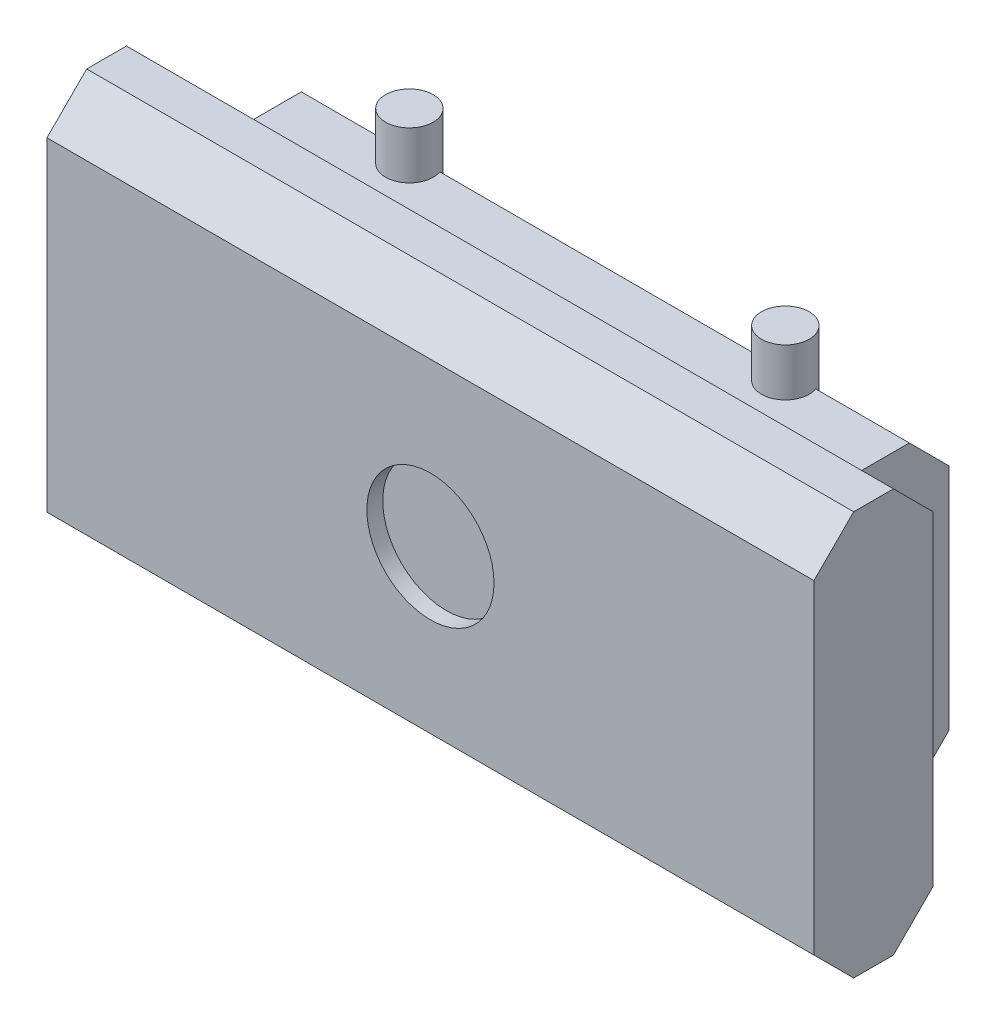
ISO-10303-21;
HEADER;
FILE_DESCRIPTION(('STEP AP214'),'2;1');
FILE_NAME('part.step','',(''),(''),'','','');
FILE_SCHEMA(('AUTOMOTIVE_DESIGN { 1 0 10303 214 1 1 1 1 }'));
ENDSEC;
DATA;
#1=APPLICATION_CONTEXT('core data for automotive mechanical design processes');
#2=APPLICATION_PROTOCOL_DEFINITION('international standard','automotive_design',2000,#1);
#3=PRODUCT_CONTEXT('',#1,'mechanical');
#4=PRODUCT('Part','Part','',(#3));
#5=PRODUCT_RELATED_PRODUCT_CATEGORY('part','',(#4));
#6=PRODUCT_DEFINITION_FORMATION('','',#4);
#7=PRODUCT_DEFINITION_CONTEXT('part definition',#1,'design');
#8=PRODUCT_DEFINITION('design','',#6,#7);
#9=PRODUCT_DEFINITION_SHAPE('','',#8);
#10=(LENGTH_UNIT() NAMED_UNIT(*) SI_UNIT(.MILLI.,.METRE.));
#11=(NAMED_UNIT(*) PLANE_ANGLE_UNIT() SI_UNIT($,.RADIAN.));
#12=(NAMED_UNIT(*) SI_UNIT($,.STERADIAN.) SOLID_ANGLE_UNIT());
#13=UNCERTAINTY_MEASURE_WITH_UNIT(LENGTH_MEASURE(1.E-05),#10,'distance_accuracy_value','');
#14=(GEOMETRIC_REPRESENTATION_CONTEXT(3) GLOBAL_UNCERTAINTY_ASSIGNED_CONTEXT((#13)) GLOBAL_UNIT_ASSIGNED_CONTEXT((#10,
#11,#12)) REPRESENTATION_CONTEXT('',''));
#15=CARTESIAN_POINT('',(0.,0.,0.));
#16=DIRECTION('',(0.,0.,1.));
#17=DIRECTION('',(1.,0.,0.));
#18=AXIS2_PLACEMENT_3D('',#15,#16,#17);
#19=CARTESIAN_POINT('',(236.5,194.,-60.));
#20=DIRECTION('',(0.,1.,0.));
#21=DIRECTION('',(0.,0.,1.));
#22=AXIS2_PLACEMENT_3D('',#19,#20,#21);
#23=CYLINDRICAL_SURFACE('',#22,30.);
#24=CARTESIAN_POINT('',(236.5,194.,-60.));
#25=DIRECTION('',(0.,-1.,0.));
#26=DIRECTION('',(0.,0.,-1.));
#27=AXIS2_PLACEMENT_3D('',#24,#25,#26);
#28=CIRCLE('',#27,30.);
#29=CARTESIAN_POINT('',(264.784271247462,194.,-70.0000000000002));
#30=VERTEX_POINT('',#29);
#31=CARTESIAN_POINT('',(208.215728752538,194.,-70.0000000000002));
#32=VERTEX_POINT('',#31);
#33=EDGE_CURVE('E270',#30,#32,#28,.T.);
#34=ORIENTED_EDGE('',*,*,#33,.F.);
#35=CARTESIAN_POINT('',(236.5,204.,-60.));
#36=DIRECTION('',(0.,0.707106781186546,-0.707106781186549));
#37=DIRECTION('',(0.,0.707106781186549,0.707106781186546));
#38=AXIS2_PLACEMENT_3D('',#35,#36,#37);
#39=ELLIPSE('',#38,42.426406871193,30.);
#40=EDGE_CURVE('E368',#30,#32,#39,.T.);
#41=ORIENTED_EDGE('',*,*,#40,.T.);
#42=EDGE_LOOP('',(#34,#41));
#43=FACE_BOUND('',#42,.T.);
#44=CARTESIAN_POINT('',(236.5,254.,-60.));
#45=DIRECTION('',(0.,-1.,0.));
#46=DIRECTION('',(0.,0.,-1.));
#47=AXIS2_PLACEMENT_3D('',#44,#45,#46);
#48=CIRCLE('',#47,30.);
#49=CARTESIAN_POINT('',(236.5,254.,-90.));
#50=VERTEX_POINT('',#49);
#51=EDGE_CURVE('E266',#50,#50,#48,.T.);
#52=ORIENTED_EDGE('',*,*,#51,.T.);
#53=EDGE_LOOP('',(#52));
#54=FACE_BOUND('',#53,.T.);
#55=ADVANCED_FACE('F47',(#43,#54),#23,.T.);
#56=CARTESIAN_POINT('',(236.5,254.,-60.));
#57=DIRECTION('',(0.,-1.,0.));
#58=DIRECTION('',(0.,0.,-1.));
#59=AXIS2_PLACEMENT_3D('',#56,#57,#58);
#60=PLANE('',#59);
#61=ORIENTED_EDGE('',*,*,#51,.F.);
#62=EDGE_LOOP('',(#61));
#63=FACE_BOUND('',#62,.T.);
#64=ADVANCED_FACE('F428',(#63),#60,.F.);
#65=CARTESIAN_POINT('',(-236.5,194.,-60.));
#66=DIRECTION('',(0.,1.,0.));
#67=DIRECTION('',(0.,0.,1.));
#68=AXIS2_PLACEMENT_3D('',#65,#66,#67);
#69=CYLINDRICAL_SURFACE('',#68,30.);
#70=CARTESIAN_POINT('',(-236.5,194.,-60.));
#71=DIRECTION('',(0.,-1.,0.));
#72=DIRECTION('',(0.,0.,-1.));
#73=AXIS2_PLACEMENT_3D('',#70,#71,#72);
#74=CIRCLE('',#73,30.);
#75=CARTESIAN_POINT('',(-208.215728752538,194.,-70.0000000000002));
#76=VERTEX_POINT('',#75);
#77=CARTESIAN_POINT('',(-264.784271247462,194.,-70.0000000000002));
#78=VERTEX_POINT('',#77);
#79=EDGE_CURVE('E262',#76,#78,#74,.T.);
#80=ORIENTED_EDGE('',*,*,#79,.F.);
#81=CARTESIAN_POINT('',(-236.5,204.,-60.));
#82=DIRECTION('',(0.,0.707106781186546,-0.707106781186549));
#83=DIRECTION('',(0.,0.707106781186549,0.707106781186546));
#84=AXIS2_PLACEMENT_3D('',#81,#82,#83);
#85=ELLIPSE('',#84,42.426406871193,30.);
#86=EDGE_CURVE('E371',#76,#78,#85,.T.);
#87=ORIENTED_EDGE('',*,*,#86,.T.);
#88=EDGE_LOOP('',(#80,#87));
#89=FACE_BOUND('',#88,.T.);
#90=CARTESIAN_POINT('',(-236.5,254.,-60.));
#91=DIRECTION('',(0.,-1.,0.));
#92=DIRECTION('',(0.,0.,-1.));
#93=AXIS2_PLACEMENT_3D('',#90,#91,#92);
#94=CIRCLE('',#93,30.);
#95=CARTESIAN_POINT('',(-236.5,254.,-90.));
#96=VERTEX_POINT('',#95);
#97=EDGE_CURVE('E261',#96,#96,#94,.T.);
#98=ORIENTED_EDGE('',*,*,#97,.T.);
#99=EDGE_LOOP('',(#98));
#100=FACE_BOUND('',#99,.T.);
#101=ADVANCED_FACE('F434',(#89,#100),#69,.T.);
#102=CARTESIAN_POINT('',(-236.5,254.,-60.));
#103=DIRECTION('',(0.,-1.,0.));
#104=DIRECTION('',(0.,0.,-1.));
#105=AXIS2_PLACEMENT_3D('',#102,#103,#104);
#106=PLANE('',#105);
#107=ORIENTED_EDGE('',*,*,#97,.F.);
#108=EDGE_LOOP('',(#107));
#109=FACE_BOUND('',#108,.T.);
#110=ADVANCED_FACE('F382',(#109),#106,.F.);
#111=CARTESIAN_POINT('',(-482.5,-254.,150.));
#112=DIRECTION('',(1.,0.,0.));
#113=DIRECTION('',(0.,0.,-1.));
#114=AXIS2_PLACEMENT_3D('',#111,#112,#113);
#115=PLANE('',#114);
#116=CARTESIAN_POINT('',(-482.5,-114.,75.));
#117=DIRECTION('',(1.,0.,0.));
#118=DIRECTION('',(0.,0.,-1.));
#119=AXIS2_PLACEMENT_3D('',#116,#117,#118);
#120=CIRCLE('',#119,60.);
#121=CARTESIAN_POINT('',(-482.5,-114.,15.));
#122=VERTEX_POINT('',#121);
#123=EDGE_CURVE('E11',#122,#122,#120,.F.);
#124=ORIENTED_EDGE('',*,*,#123,.F.);
#125=EDGE_LOOP('',(#124));
#126=FACE_BOUND('',#125,.T.);
#127=CARTESIAN_POINT('',(-482.5,114.,75.));
#128=DIRECTION('',(1.,0.,0.));
#129=DIRECTION('',(0.,0.,-1.));
#130=AXIS2_PLACEMENT_3D('',#127,#128,#129);
#131=CIRCLE('',#130,60.);
#132=CARTESIAN_POINT('',(-482.5,114.,15.));
#133=VERTEX_POINT('',#132);
#134=EDGE_CURVE('E57',#133,#133,#131,.F.);
#135=ORIENTED_EDGE('',*,*,#134,.F.);
#136=EDGE_LOOP('',(#135));
#137=FACE_BOUND('',#136,.T.);
#138=DIRECTION('',(0.,-1.,0.));
#139=VECTOR('',#138,1.);
#140=CARTESIAN_POINT('',(-482.5,-254.,0.));
#141=LINE('',#140,#139);
#142=CARTESIAN_POINT('',(-482.5,204.,0.));
#143=VERTEX_POINT('',#142);
#144=CARTESIAN_POINT('',(-482.5,-204.,0.));
#145=VERTEX_POINT('',#144);
#146=EDGE_CURVE('E225',#143,#145,#141,.T.);
#147=ORIENTED_EDGE('',*,*,#146,.T.);
#148=DIRECTION('',(0.,0.707106781186548,-0.707106781186547));
#149=VECTOR('',#148,1.);
#150=CARTESIAN_POINT('',(-482.5,-254.,50.));
#151=LINE('',#150,#149);
#152=CARTESIAN_POINT('',(-482.5,-254.,50.));
#153=VERTEX_POINT('',#152);
#154=EDGE_CURVE('E345',#145,#153,#151,.F.);
#155=ORIENTED_EDGE('',*,*,#154,.T.);
#156=DIRECTION('',(0.,0.,-1.));
#157=VECTOR('',#156,1.);
#158=CARTESIAN_POINT('',(-482.5,-254.,150.));
#159=LINE('',#158,#157);
#160=CARTESIAN_POINT('',(-482.5,-254.,99.9999999999998));
#161=VERTEX_POINT('',#160);
#162=EDGE_CURVE('E257',#161,#153,#159,.T.);
#163=ORIENTED_EDGE('',*,*,#162,.F.);
#164=DIRECTION('',(0.,0.707106781186547,0.707106781186548));
#165=VECTOR('',#164,1.);
#166=CARTESIAN_POINT('',(-482.5,-204.,150.));
#167=LINE('',#166,#165);
#168=CARTESIAN_POINT('',(-482.5,-204.,150.));
#169=VERTEX_POINT('',#168);
#170=EDGE_CURVE('E340',#161,#169,#167,.T.);
#171=ORIENTED_EDGE('',*,*,#170,.T.);
#172=DIRECTION('',(0.,-1.,0.));
#173=VECTOR('',#172,1.);
#174=CARTESIAN_POINT('',(-482.5,-254.,150.));
#175=LINE('',#174,#173);
#176=CARTESIAN_POINT('',(-482.5,204.,150.));
#177=VERTEX_POINT('',#176);
#178=EDGE_CURVE('E231',#177,#169,#175,.T.);
#179=ORIENTED_EDGE('',*,*,#178,.F.);
#180=DIRECTION('',(0.,0.707106781186547,-0.707106781186548));
#181=VECTOR('',#180,1.);
#182=CARTESIAN_POINT('',(-482.5,204.,150.));
#183=LINE('',#182,#181);
#184=CARTESIAN_POINT('',(-482.5,254.,99.9999999999998));
#185=VERTEX_POINT('',#184);
#186=EDGE_CURVE('E72',#177,#185,#183,.T.);
#187=ORIENTED_EDGE('',*,*,#186,.T.);
#188=DIRECTION('',(0.,0.,-1.));
#189=VECTOR('',#188,1.);
#190=CARTESIAN_POINT('',(-482.5,254.,150.));
#191=LINE('',#190,#189);
#192=CARTESIAN_POINT('',(-482.5,254.,50.));
#193=VERTEX_POINT('',#192);
#194=EDGE_CURVE('E240',#185,#193,#191,.T.);
#195=ORIENTED_EDGE('',*,*,#194,.T.);
#196=DIRECTION('',(0.,0.707106781186548,0.707106781186547));
#197=VECTOR('',#196,1.);
#198=CARTESIAN_POINT('',(-482.5,254.,50.0000000000001));
#199=LINE('',#198,#197);
#200=EDGE_CURVE('E64',#193,#143,#199,.F.);
#201=ORIENTED_EDGE('',*,*,#200,.T.);
#202=EDGE_LOOP('',(#147,#155,#163,#171,#179,#187,#195,#201));
#203=FACE_BOUND('',#202,.T.);
#204=ADVANCED_FACE('F379',(#126,#137,#203),#115,.F.);
#205=CARTESIAN_POINT('',(482.5,-254.,150.));
#206=DIRECTION('',(0.,1.,0.));
#207=DIRECTION('',(-1.,0.,0.));
#208=AXIS2_PLACEMENT_3D('',#205,#206,#207);
#209=PLANE('',#208);
#210=ORIENTED_EDGE('',*,*,#162,.T.);
#211=DIRECTION('',(1.,0.,0.));
#212=VECTOR('',#211,1.);
#213=CARTESIAN_POINT('',(482.5,-254.,50.));
#214=LINE('',#213,#212);
#215=CARTESIAN_POINT('',(482.5,-254.,50.));
#216=VERTEX_POINT('',#215);
#217=EDGE_CURVE('E316',#153,#216,#214,.T.);
#218=ORIENTED_EDGE('',*,*,#217,.T.);
#219=DIRECTION('',(0.,0.,-1.));
#220=VECTOR('',#219,1.);
#221=CARTESIAN_POINT('',(482.5,-254.,150.));
#222=LINE('',#221,#220);
#223=CARTESIAN_POINT('',(482.5,-254.,99.9999999999998));
#224=VERTEX_POINT('',#223);
#225=EDGE_CURVE('E253',#224,#216,#222,.T.);
#226=ORIENTED_EDGE('',*,*,#225,.F.);
#227=DIRECTION('',(-1.,0.,0.));
#228=VECTOR('',#227,1.);
#229=CARTESIAN_POINT('',(-482.5,-254.,99.9999999999998));
#230=LINE('',#229,#228);
#231=EDGE_CURVE('E313',#224,#161,#230,.T.);
#232=ORIENTED_EDGE('',*,*,#231,.T.);
#233=EDGE_LOOP('',(#210,#218,#226,#232));
#234=FACE_BOUND('',#233,.T.);
#235=ADVANCED_FACE('F381',(#234),#209,.F.);
#236=CARTESIAN_POINT('',(482.5,-254.,150.));
#237=DIRECTION('',(-1.,0.,0.));
#238=DIRECTION('',(0.,0.,1.));
#239=AXIS2_PLACEMENT_3D('',#236,#237,#238);
#240=PLANE('',#239);
#241=ORIENTED_EDGE('',*,*,#225,.T.);
#242=DIRECTION('',(0.,-0.707106781186548,0.707106781186547));
#243=VECTOR('',#242,1.);
#244=CARTESIAN_POINT('',(482.5,-254.,50.));
#245=LINE('',#244,#243);
#246=CARTESIAN_POINT('',(482.5,-204.,0.));
#247=VERTEX_POINT('',#246);
#248=EDGE_CURVE('E329',#216,#247,#245,.F.);
#249=ORIENTED_EDGE('',*,*,#248,.T.);
#250=DIRECTION('',(0.,1.,0.));
#251=VECTOR('',#250,1.);
#252=CARTESIAN_POINT('',(482.5,-254.,0.));
#253=LINE('',#252,#251);
#254=CARTESIAN_POINT('',(482.5,204.,0.));
#255=VERTEX_POINT('',#254);
#256=EDGE_CURVE('E236',#247,#255,#253,.T.);
#257=ORIENTED_EDGE('',*,*,#256,.T.);
#258=DIRECTION('',(0.,-0.707106781186548,-0.707106781186547));
#259=VECTOR('',#258,1.);
#260=CARTESIAN_POINT('',(482.5,254.,50.));
#261=LINE('',#260,#259);
#262=CARTESIAN_POINT('',(482.5,254.,50.));
#263=VERTEX_POINT('',#262);
#264=EDGE_CURVE('E326',#255,#263,#261,.F.);
#265=ORIENTED_EDGE('',*,*,#264,.T.);
#266=DIRECTION('',(0.,0.,-1.));
#267=VECTOR('',#266,1.);
#268=CARTESIAN_POINT('',(482.5,254.,150.));
#269=LINE('',#268,#267);
#270=CARTESIAN_POINT('',(482.5,254.,99.9999999999998));
#271=VERTEX_POINT('',#270);
#272=EDGE_CURVE('E249',#271,#263,#269,.T.);
#273=ORIENTED_EDGE('',*,*,#272,.F.);
#274=DIRECTION('',(0.,-0.707106781186547,0.707106781186548));
#275=VECTOR('',#274,1.);
#276=CARTESIAN_POINT('',(482.5,204.,150.));
#277=LINE('',#276,#275);
#278=CARTESIAN_POINT('',(482.5,204.,150.));
#279=VERTEX_POINT('',#278);
#280=EDGE_CURVE('E320',#271,#279,#277,.T.);
#281=ORIENTED_EDGE('',*,*,#280,.T.);
#282=DIRECTION('',(0.,1.,0.));
#283=VECTOR('',#282,1.);
#284=CARTESIAN_POINT('',(482.5,-254.,150.));
#285=LINE('',#284,#283);
#286=CARTESIAN_POINT('',(482.5,-204.,150.));
#287=VERTEX_POINT('',#286);
#288=EDGE_CURVE('E235',#287,#279,#285,.T.);
#289=ORIENTED_EDGE('',*,*,#288,.F.);
#290=DIRECTION('',(0.,-0.707106781186547,-0.707106781186548));
#291=VECTOR('',#290,1.);
#292=CARTESIAN_POINT('',(482.5,-204.,150.));
#293=LINE('',#292,#291);
#294=EDGE_CURVE('E323',#287,#224,#293,.T.);
#295=ORIENTED_EDGE('',*,*,#294,.T.);
#296=EDGE_LOOP('',(#241,#249,#257,#265,#273,#281,#289,#295));
#297=FACE_BOUND('',#296,.T.);
#298=ADVANCED_FACE('F398',(#297),#240,.F.);
#299=CARTESIAN_POINT('',(482.5,254.,150.));
#300=DIRECTION('',(0.,-1.,0.));
#301=DIRECTION('',(1.,0.,0.));
#302=AXIS2_PLACEMENT_3D('',#299,#300,#301);
#303=PLANE('',#302);
#304=ORIENTED_EDGE('',*,*,#272,.T.);
#305=DIRECTION('',(-1.,0.,0.));
#306=VECTOR('',#305,1.);
#307=CARTESIAN_POINT('',(482.5,254.,50.));
#308=LINE('',#307,#306);
#309=EDGE_CURVE('E351',#263,#193,#308,.T.);
#310=ORIENTED_EDGE('',*,*,#309,.T.);
#311=ORIENTED_EDGE('',*,*,#194,.F.);
#312=DIRECTION('',(1.,0.,0.));
#313=VECTOR('',#312,1.);
#314=CARTESIAN_POINT('',(482.5,254.,99.9999999999998));
#315=LINE('',#314,#313);
#316=EDGE_CURVE('E348',#185,#271,#315,.T.);
#317=ORIENTED_EDGE('',*,*,#316,.T.);
#318=EDGE_LOOP('',(#304,#310,#311,#317));
#319=FACE_BOUND('',#318,.T.);
#320=ADVANCED_FACE('F413',(#319),#303,.F.);
#321=CARTESIAN_POINT('',(0.,0.,150.));
#322=DIRECTION('',(0.,0.,1.));
#323=DIRECTION('',(1.,0.,0.));
#324=AXIS2_PLACEMENT_3D('',#321,#322,#323);
#325=PLANE('',#324);
#326=CARTESIAN_POINT('',(0.,0.,150.));
#327=DIRECTION('',(0.,0.,1.));
#328=DIRECTION('',(1.,0.,0.));
#329=AXIS2_PLACEMENT_3D('',#326,#327,#328);
#330=CIRCLE('',#329,80.);
#331=CARTESIAN_POINT('',(80.,0.,150.));
#332=VERTEX_POINT('',#331);
#333=EDGE_CURVE('E677',#332,#332,#330,.T.);
#334=ORIENTED_EDGE('',*,*,#333,.F.);
#335=EDGE_LOOP('',(#334));
#336=FACE_BOUND('',#335,.T.);
#337=ORIENTED_EDGE('',*,*,#178,.T.);
#338=DIRECTION('',(1.,0.,0.));
#339=VECTOR('',#338,1.);
#340=CARTESIAN_POINT('',(482.5,-204.,150.));
#341=LINE('',#340,#339);
#342=EDGE_CURVE('E358',#169,#287,#341,.T.);
#343=ORIENTED_EDGE('',*,*,#342,.T.);
#344=ORIENTED_EDGE('',*,*,#288,.T.);
#345=DIRECTION('',(-1.,0.,0.));
#346=VECTOR('',#345,1.);
#347=CARTESIAN_POINT('',(-482.5,204.,150.));
#348=LINE('',#347,#346);
#349=EDGE_CURVE('E354',#279,#177,#348,.T.);
#350=ORIENTED_EDGE('',*,*,#349,.T.);
#351=EDGE_LOOP('',(#337,#343,#344,#350));
#352=FACE_BOUND('',#351,.T.);
#353=ADVANCED_FACE('F406',(#336,#352),#325,.T.);
#354=CARTESIAN_POINT('',(0.,0.,0.));
#355=DIRECTION('',(0.,0.,1.));
#356=DIRECTION('',(1.,0.,0.));
#357=AXIS2_PLACEMENT_3D('',#354,#355,#356);
#358=PLANE('',#357);
#359=DIRECTION('',(-1.,0.,0.));
#360=VECTOR('',#359,1.);
#361=CARTESIAN_POINT('',(382.5,194.,0.));
#362=LINE('',#361,#360);
#363=CARTESIAN_POINT('',(382.5,194.,0.));
#364=VERTEX_POINT('',#363);
#365=CARTESIAN_POINT('',(-382.5,194.,0.));
#366=VERTEX_POINT('',#365);
#367=EDGE_CURVE('E206',#364,#366,#362,.T.);
#368=ORIENTED_EDGE('',*,*,#367,.T.);
#369=DIRECTION('',(0.,-1.,0.));
#370=VECTOR('',#369,1.);
#371=CARTESIAN_POINT('',(-382.5,-194.,0.));
#372=LINE('',#371,#370);
#373=CARTESIAN_POINT('',(-382.5,-194.,0.));
#374=VERTEX_POINT('',#373);
#375=EDGE_CURVE('E182',#366,#374,#372,.T.);
#376=ORIENTED_EDGE('',*,*,#375,.T.);
#377=DIRECTION('',(1.,0.,0.));
#378=VECTOR('',#377,1.);
#379=CARTESIAN_POINT('',(382.5,-194.,0.));
#380=LINE('',#379,#378);
#381=CARTESIAN_POINT('',(382.5,-194.,0.));
#382=VERTEX_POINT('',#381);
#383=EDGE_CURVE('E194',#374,#382,#380,.T.);
#384=ORIENTED_EDGE('',*,*,#383,.T.);
#385=DIRECTION('',(0.,1.,0.));
#386=VECTOR('',#385,1.);
#387=CARTESIAN_POINT('',(382.5,-194.,0.));
#388=LINE('',#387,#386);
#389=EDGE_CURVE('E201',#382,#364,#388,.T.);
#390=ORIENTED_EDGE('',*,*,#389,.T.);
#391=EDGE_LOOP('',(#368,#376,#384,#390));
#392=FACE_BOUND('',#391,.T.);
#393=ORIENTED_EDGE('',*,*,#256,.F.);
#394=DIRECTION('',(-1.,0.,0.));
#395=VECTOR('',#394,1.);
#396=CARTESIAN_POINT('',(0.,-204.,0.));
#397=LINE('',#396,#395);
#398=EDGE_CURVE('E335',#247,#145,#397,.T.);
#399=ORIENTED_EDGE('',*,*,#398,.T.);
#400=ORIENTED_EDGE('',*,*,#146,.F.);
#401=DIRECTION('',(1.,0.,0.));
#402=VECTOR('',#401,1.);
#403=CARTESIAN_POINT('',(0.,204.,0.));
#404=LINE('',#403,#402);
#405=EDGE_CURVE('E332',#143,#255,#404,.T.);
#406=ORIENTED_EDGE('',*,*,#405,.T.);
#407=EDGE_LOOP('',(#393,#399,#400,#406));
#408=FACE_BOUND('',#407,.T.);
#409=ADVANCED_FACE('F203',(#392,#408),#358,.F.);
#410=CARTESIAN_POINT('',(-382.5,-194.,-120.));
#411=DIRECTION('',(-1.,0.,0.));
#412=DIRECTION('',(0.,0.,1.));
#413=AXIS2_PLACEMENT_3D('',#410,#411,#412);
#414=PLANE('',#413);
#415=DIRECTION('',(0.,-1.,0.));
#416=VECTOR('',#415,1.);
#417=CARTESIAN_POINT('',(-382.5,-194.,-120.));
#418=LINE('',#417,#416);
#419=CARTESIAN_POINT('',(-382.5,144.,-120.));
#420=VERTEX_POINT('',#419);
#421=CARTESIAN_POINT('',(-382.5,-144.,-120.));
#422=VERTEX_POINT('',#421);
#423=EDGE_CURVE('E221',#420,#422,#418,.T.);
#424=ORIENTED_EDGE('',*,*,#423,.T.);
#425=DIRECTION('',(0.,-0.707106781186549,0.707106781186546));
#426=VECTOR('',#425,1.);
#427=CARTESIAN_POINT('',(-382.5,-169.,-94.9999999999999));
#428=LINE('',#427,#426);
#429=CARTESIAN_POINT('',(-382.5,-194.,-70.0000000000001));
#430=VERTEX_POINT('',#429);
#431=EDGE_CURVE('E185',#422,#430,#428,.T.);
#432=ORIENTED_EDGE('',*,*,#431,.T.);
#433=DIRECTION('',(0.,0.,1.));
#434=VECTOR('',#433,1.);
#435=CARTESIAN_POINT('',(-382.5,-194.,-120.));
#436=LINE('',#435,#434);
#437=EDGE_CURVE('E176',#430,#374,#436,.T.);
#438=ORIENTED_EDGE('',*,*,#437,.T.);
#439=ORIENTED_EDGE('',*,*,#375,.F.);
#440=DIRECTION('',(0.,0.,1.));
#441=VECTOR('',#440,1.);
#442=CARTESIAN_POINT('',(-382.5,194.,-120.));
#443=LINE('',#442,#441);
#444=CARTESIAN_POINT('',(-382.5,194.,-70.0000000000002));
#445=VERTEX_POINT('',#444);
#446=EDGE_CURVE('E222',#445,#366,#443,.T.);
#447=ORIENTED_EDGE('',*,*,#446,.F.);
#448=DIRECTION('',(0.,-0.707106781186549,-0.707106781186546));
#449=VECTOR('',#448,1.);
#450=CARTESIAN_POINT('',(-382.5,-25.0000000000008,-289.));
#451=LINE('',#450,#449);
#452=EDGE_CURVE('E298',#445,#420,#451,.T.);
#453=ORIENTED_EDGE('',*,*,#452,.T.);
#454=EDGE_LOOP('',(#424,#432,#438,#439,#447,#453));
#455=FACE_BOUND('',#454,.T.);
#456=ADVANCED_FACE('F179',(#455),#414,.T.);
#457=CARTESIAN_POINT('',(382.5,194.,-120.));
#458=DIRECTION('',(0.,1.,0.));
#459=DIRECTION('',(0.,0.,1.));
#460=AXIS2_PLACEMENT_3D('',#457,#458,#459);
#461=PLANE('',#460);
#462=DIRECTION('',(0.,0.,1.));
#463=VECTOR('',#462,1.);
#464=CARTESIAN_POINT('',(382.5,194.,-120.));
#465=LINE('',#464,#463);
#466=CARTESIAN_POINT('',(382.5,194.,-70.0000000000002));
#467=VERTEX_POINT('',#466);
#468=EDGE_CURVE('E226',#467,#364,#465,.T.);
#469=ORIENTED_EDGE('',*,*,#468,.F.);
#470=DIRECTION('',(-1.,0.,0.));
#471=VECTOR('',#470,1.);
#472=CARTESIAN_POINT('',(-382.5,194.,-70.0000000000002));
#473=LINE('',#472,#471);
#474=EDGE_CURVE('E309',#467,#30,#473,.T.);
#475=ORIENTED_EDGE('',*,*,#474,.T.);
#476=ORIENTED_EDGE('',*,*,#33,.T.);
#477=DIRECTION('',(-1.,0.,0.));
#478=VECTOR('',#477,1.);
#479=CARTESIAN_POINT('',(-382.5,194.,-70.0000000000002));
#480=LINE('',#479,#478);
#481=EDGE_CURVE('E306',#32,#76,#480,.T.);
#482=ORIENTED_EDGE('',*,*,#481,.T.);
#483=ORIENTED_EDGE('',*,*,#79,.T.);
#484=DIRECTION('',(-1.,0.,0.));
#485=VECTOR('',#484,1.);
#486=CARTESIAN_POINT('',(-382.5,194.,-70.0000000000002));
#487=LINE('',#486,#485);
#488=EDGE_CURVE('E303',#78,#445,#487,.T.);
#489=ORIENTED_EDGE('',*,*,#488,.T.);
#490=ORIENTED_EDGE('',*,*,#446,.T.);
#491=ORIENTED_EDGE('',*,*,#367,.F.);
#492=EDGE_LOOP('',(#469,#475,#476,#482,#483,#489,#490,#491));
#493=FACE_BOUND('',#492,.T.);
#494=ADVANCED_FACE('F422',(#493),#461,.T.);
#495=CARTESIAN_POINT('',(382.5,-194.,-120.));
#496=DIRECTION('',(1.,0.,0.));
#497=DIRECTION('',(0.,0.,-1.));
#498=AXIS2_PLACEMENT_3D('',#495,#496,#497);
#499=PLANE('',#498);
#500=DIRECTION('',(0.,0.,1.));
#501=VECTOR('',#500,1.);
#502=CARTESIAN_POINT('',(382.5,-194.,-120.));
#503=LINE('',#502,#501);
#504=CARTESIAN_POINT('',(382.5,-194.,-70.0000000000001));
#505=VERTEX_POINT('',#504);
#506=EDGE_CURVE('E190',#505,#382,#503,.T.);
#507=ORIENTED_EDGE('',*,*,#506,.F.);
#508=DIRECTION('',(0.,0.707106781186549,-0.707106781186546));
#509=VECTOR('',#508,1.);
#510=CARTESIAN_POINT('',(382.5,-169.,-94.9999999999999));
#511=LINE('',#510,#509);
#512=CARTESIAN_POINT('',(382.5,-144.,-120.));
#513=VERTEX_POINT('',#512);
#514=EDGE_CURVE('E289',#505,#513,#511,.T.);
#515=ORIENTED_EDGE('',*,*,#514,.T.);
#516=DIRECTION('',(0.,1.,0.));
#517=VECTOR('',#516,1.);
#518=CARTESIAN_POINT('',(382.5,-194.,-120.));
#519=LINE('',#518,#517);
#520=CARTESIAN_POINT('',(382.5,144.,-120.));
#521=VERTEX_POINT('',#520);
#522=EDGE_CURVE('E191',#513,#521,#519,.T.);
#523=ORIENTED_EDGE('',*,*,#522,.T.);
#524=DIRECTION('',(0.,0.707106781186549,0.707106781186546));
#525=VECTOR('',#524,1.);
#526=CARTESIAN_POINT('',(382.5,-25.0000000000008,-289.));
#527=LINE('',#526,#525);
#528=EDGE_CURVE('E286',#521,#467,#527,.T.);
#529=ORIENTED_EDGE('',*,*,#528,.T.);
#530=ORIENTED_EDGE('',*,*,#468,.T.);
#531=ORIENTED_EDGE('',*,*,#389,.F.);
#532=EDGE_LOOP('',(#507,#515,#523,#529,#530,#531));
#533=FACE_BOUND('',#532,.T.);
#534=ADVANCED_FACE('F509',(#533),#499,.T.);
#535=CARTESIAN_POINT('',(382.5,-194.,-120.));
#536=DIRECTION('',(0.,-1.,0.));
#537=DIRECTION('',(0.,0.,-1.));
#538=AXIS2_PLACEMENT_3D('',#535,#536,#537);
#539=PLANE('',#538);
#540=ORIENTED_EDGE('',*,*,#437,.F.);
#541=DIRECTION('',(1.,0.,0.));
#542=VECTOR('',#541,1.);
#543=CARTESIAN_POINT('',(382.5,-194.,-70.0000000000001));
#544=LINE('',#543,#542);
#545=CARTESIAN_POINT('',(-264.784271247462,-194.,-70.0000000000001));
#546=VERTEX_POINT('',#545);
#547=EDGE_CURVE('E283',#430,#546,#544,.T.);
#548=ORIENTED_EDGE('',*,*,#547,.T.);
#549=CARTESIAN_POINT('',(-236.5,-194.,-60.));
#550=DIRECTION('',(0.,-1.,0.));
#551=DIRECTION('',(0.,0.,-1.));
#552=AXIS2_PLACEMENT_3D('',#549,#550,#551);
#553=CIRCLE('',#552,30.);
#554=CARTESIAN_POINT('',(-208.215728752538,-194.,-70.0000000000001));
#555=VERTEX_POINT('',#554);
#556=EDGE_CURVE('E702',#555,#546,#553,.T.);
#557=ORIENTED_EDGE('',*,*,#556,.F.);
#558=DIRECTION('',(1.,0.,0.));
#559=VECTOR('',#558,1.);
#560=CARTESIAN_POINT('',(382.5,-194.,-70.0000000000001));
#561=LINE('',#560,#559);
#562=CARTESIAN_POINT('',(208.215728752538,-194.,-70.0000000000001));
#563=VERTEX_POINT('',#562);
#564=EDGE_CURVE('E280',#555,#563,#561,.T.);
#565=ORIENTED_EDGE('',*,*,#564,.T.);
#566=CARTESIAN_POINT('',(236.5,-194.,-60.));
#567=DIRECTION('',(0.,-1.,0.));
#568=DIRECTION('',(0.,0.,-1.));
#569=AXIS2_PLACEMENT_3D('',#566,#567,#568);
#570=CIRCLE('',#569,30.);
#571=CARTESIAN_POINT('',(264.784271247462,-194.,-70.0000000000001));
#572=VERTEX_POINT('',#571);
#573=EDGE_CURVE('E212',#572,#563,#570,.T.);
#574=ORIENTED_EDGE('',*,*,#573,.F.);
#575=DIRECTION('',(1.,0.,0.));
#576=VECTOR('',#575,1.);
#577=CARTESIAN_POINT('',(382.5,-194.,-70.0000000000001));
#578=LINE('',#577,#576);
#579=EDGE_CURVE('E274',#572,#505,#578,.T.);
#580=ORIENTED_EDGE('',*,*,#579,.T.);
#581=ORIENTED_EDGE('',*,*,#506,.T.);
#582=ORIENTED_EDGE('',*,*,#383,.F.);
#583=EDGE_LOOP('',(#540,#548,#557,#565,#574,#580,#581,#582));
#584=FACE_BOUND('',#583,.T.);
#585=ADVANCED_FACE('F195',(#584),#539,.T.);
#586=CARTESIAN_POINT('',(0.,0.,-120.));
#587=DIRECTION('',(0.,0.,1.));
#588=DIRECTION('',(1.,0.,0.));
#589=AXIS2_PLACEMENT_3D('',#586,#587,#588);
#590=PLANE('',#589);
#591=ORIENTED_EDGE('',*,*,#522,.F.);
#592=DIRECTION('',(-1.,0.,0.));
#593=VECTOR('',#592,1.);
#594=CARTESIAN_POINT('',(-382.5,-144.,-120.));
#595=LINE('',#594,#593);
#596=EDGE_CURVE('E295',#513,#422,#595,.T.);
#597=ORIENTED_EDGE('',*,*,#596,.T.);
#598=ORIENTED_EDGE('',*,*,#423,.F.);
#599=DIRECTION('',(1.,0.,0.));
#600=VECTOR('',#599,1.);
#601=CARTESIAN_POINT('',(382.5,144.,-120.));
#602=LINE('',#601,#600);
#603=EDGE_CURVE('E292',#420,#521,#602,.T.);
#604=ORIENTED_EDGE('',*,*,#603,.T.);
#605=EDGE_LOOP('',(#591,#597,#598,#604));
#606=FACE_BOUND('',#605,.T.);
#607=ADVANCED_FACE('F502',(#606),#590,.F.);
#608=CARTESIAN_POINT('',(236.5,-254.,-60.));
#609=DIRECTION('',(0.,1.,0.));
#610=DIRECTION('',(0.,0.,1.));
#611=AXIS2_PLACEMENT_3D('',#608,#609,#610);
#612=CYLINDRICAL_SURFACE('',#611,30.);
#613=CARTESIAN_POINT('',(236.5,-254.,-60.));
#614=DIRECTION('',(0.,-1.,0.));
#615=DIRECTION('',(0.,0.,-1.));
#616=AXIS2_PLACEMENT_3D('',#613,#614,#615);
#617=CIRCLE('',#616,30.);
#618=CARTESIAN_POINT('',(236.5,-254.,-90.));
#619=VERTEX_POINT('',#618);
#620=EDGE_CURVE('E208',#619,#619,#617,.T.);
#621=ORIENTED_EDGE('',*,*,#620,.F.);
#622=EDGE_LOOP('',(#621));
#623=FACE_BOUND('',#622,.T.);
#624=ORIENTED_EDGE('',*,*,#573,.T.);
#625=CARTESIAN_POINT('',(236.5,-204.,-60.));
#626=DIRECTION('',(0.,-0.707106781186546,-0.707106781186549));
#627=DIRECTION('',(0.,0.707106781186549,-0.707106781186546));
#628=AXIS2_PLACEMENT_3D('',#625,#626,#627);
#629=ELLIPSE('',#628,42.426406871193,30.);
#630=EDGE_CURVE('E365',#563,#572,#629,.T.);
#631=ORIENTED_EDGE('',*,*,#630,.T.);
#632=EDGE_LOOP('',(#624,#631));
#633=FACE_BOUND('',#632,.T.);
#634=ADVANCED_FACE('F498',(#623,#633),#612,.T.);
#635=CARTESIAN_POINT('',(236.5,-254.,-60.));
#636=DIRECTION('',(0.,-1.,0.));
#637=DIRECTION('',(0.,0.,-1.));
#638=AXIS2_PLACEMENT_3D('',#635,#636,#637);
#639=PLANE('',#638);
#640=ORIENTED_EDGE('',*,*,#620,.T.);
#641=EDGE_LOOP('',(#640));
#642=FACE_BOUND('',#641,.T.);
#643=ADVANCED_FACE('F494',(#642),#639,.T.);
#644=CARTESIAN_POINT('',(-236.5,-254.,-60.));
#645=DIRECTION('',(0.,1.,0.));
#646=DIRECTION('',(0.,0.,1.));
#647=AXIS2_PLACEMENT_3D('',#644,#645,#646);
#648=CYLINDRICAL_SURFACE('',#647,30.);
#649=CARTESIAN_POINT('',(-236.5,-254.,-60.));
#650=DIRECTION('',(0.,-1.,0.));
#651=DIRECTION('',(0.,0.,-1.));
#652=AXIS2_PLACEMENT_3D('',#649,#650,#651);
#653=CIRCLE('',#652,30.);
#654=CARTESIAN_POINT('',(-236.5,-254.,-90.));
#655=VERTEX_POINT('',#654);
#656=EDGE_CURVE('E706',#655,#655,#653,.T.);
#657=ORIENTED_EDGE('',*,*,#656,.F.);
#658=EDGE_LOOP('',(#657));
#659=FACE_BOUND('',#658,.T.);
#660=ORIENTED_EDGE('',*,*,#556,.T.);
#661=CARTESIAN_POINT('',(-236.5,-204.,-60.));
#662=DIRECTION('',(0.,-0.707106781186546,-0.707106781186549));
#663=DIRECTION('',(0.,0.707106781186549,-0.707106781186546));
#664=AXIS2_PLACEMENT_3D('',#661,#662,#663);
#665=ELLIPSE('',#664,42.426406871193,30.);
#666=EDGE_CURVE('E362',#546,#555,#665,.T.);
#667=ORIENTED_EDGE('',*,*,#666,.T.);
#668=EDGE_LOOP('',(#660,#667));
#669=FACE_BOUND('',#668,.T.);
#670=ADVANCED_FACE('F490',(#659,#669),#648,.T.);
#671=CARTESIAN_POINT('',(-236.5,-254.,-60.));
#672=DIRECTION('',(0.,-1.,0.));
#673=DIRECTION('',(0.,0.,-1.));
#674=AXIS2_PLACEMENT_3D('',#671,#672,#673);
#675=PLANE('',#674);
#676=ORIENTED_EDGE('',*,*,#656,.T.);
#677=EDGE_LOOP('',(#676));
#678=FACE_BOUND('',#677,.T.);
#679=ADVANCED_FACE('F449',(#678),#675,.T.);
#680=CARTESIAN_POINT('',(382.5,-194.,-70.0000000000001));
#681=DIRECTION('',(0.,-0.707106781186546,-0.707106781186549));
#682=DIRECTION('',(-1.,0.,0.));
#683=AXIS2_PLACEMENT_3D('',#680,#681,#682);
#684=PLANE('',#683);
#685=ORIENTED_EDGE('',*,*,#431,.F.);
#686=ORIENTED_EDGE('',*,*,#596,.F.);
#687=ORIENTED_EDGE('',*,*,#514,.F.);
#688=ORIENTED_EDGE('',*,*,#579,.F.);
#689=ORIENTED_EDGE('',*,*,#630,.F.);
#690=ORIENTED_EDGE('',*,*,#564,.F.);
#691=ORIENTED_EDGE('',*,*,#666,.F.);
#692=ORIENTED_EDGE('',*,*,#547,.F.);
#693=EDGE_LOOP('',(#685,#686,#687,#688,#689,#690,#691,#692));
#694=FACE_BOUND('',#693,.T.);
#695=ADVANCED_FACE('F442',(#694),#684,.T.);
#696=CARTESIAN_POINT('',(382.5,194.,-70.0000000000002));
#697=DIRECTION('',(0.,0.707106781186546,-0.707106781186549));
#698=DIRECTION('',(1.,0.,0.));
#699=AXIS2_PLACEMENT_3D('',#696,#697,#698);
#700=PLANE('',#699);
#701=ORIENTED_EDGE('',*,*,#528,.F.);
#702=ORIENTED_EDGE('',*,*,#603,.F.);
#703=ORIENTED_EDGE('',*,*,#452,.F.);
#704=ORIENTED_EDGE('',*,*,#488,.F.);
#705=ORIENTED_EDGE('',*,*,#86,.F.);
#706=ORIENTED_EDGE('',*,*,#481,.F.);
#707=ORIENTED_EDGE('',*,*,#40,.F.);
#708=ORIENTED_EDGE('',*,*,#474,.F.);
#709=EDGE_LOOP('',(#701,#702,#703,#704,#705,#706,#707,#708));
#710=FACE_BOUND('',#709,.T.);
#711=ADVANCED_FACE('F448',(#710),#700,.T.);
#712=CARTESIAN_POINT('',(482.5,-254.,50.));
#713=DIRECTION('',(0.,0.707106781186547,0.707106781186548));
#714=DIRECTION('',(1.,0.,0.));
#715=AXIS2_PLACEMENT_3D('',#712,#713,#714);
#716=PLANE('',#715);
#717=ORIENTED_EDGE('',*,*,#154,.F.);
#718=ORIENTED_EDGE('',*,*,#398,.F.);
#719=ORIENTED_EDGE('',*,*,#248,.F.);
#720=ORIENTED_EDGE('',*,*,#217,.F.);
#721=EDGE_LOOP('',(#717,#718,#719,#720));
#722=FACE_BOUND('',#721,.T.);
#723=ADVANCED_FACE('F393',(#722),#716,.F.);
#724=CARTESIAN_POINT('',(482.5,254.,50.));
#725=DIRECTION('',(0.,-0.707106781186547,0.707106781186548));
#726=DIRECTION('',(-1.,0.,0.));
#727=AXIS2_PLACEMENT_3D('',#724,#725,#726);
#728=PLANE('',#727);
#729=ORIENTED_EDGE('',*,*,#264,.F.);
#730=ORIENTED_EDGE('',*,*,#405,.F.);
#731=ORIENTED_EDGE('',*,*,#200,.F.);
#732=ORIENTED_EDGE('',*,*,#309,.F.);
#733=EDGE_LOOP('',(#729,#730,#731,#732));
#734=FACE_BOUND('',#733,.T.);
#735=ADVANCED_FACE('F415',(#734),#728,.F.);
#736=CARTESIAN_POINT('',(0.,-204.,150.));
#737=DIRECTION('',(0.,-0.707106781186548,0.707106781186547));
#738=DIRECTION('',(-1.,0.,0.));
#739=AXIS2_PLACEMENT_3D('',#736,#737,#738);
#740=PLANE('',#739);
#741=ORIENTED_EDGE('',*,*,#170,.F.);
#742=ORIENTED_EDGE('',*,*,#231,.F.);
#743=ORIENTED_EDGE('',*,*,#294,.F.);
#744=ORIENTED_EDGE('',*,*,#342,.F.);
#745=EDGE_LOOP('',(#741,#742,#743,#744));
#746=FACE_BOUND('',#745,.T.);
#747=ADVANCED_FACE('F404',(#746),#740,.T.);
#748=CARTESIAN_POINT('',(0.,204.,150.));
#749=DIRECTION('',(0.,0.707106781186548,0.707106781186547));
#750=DIRECTION('',(1.,0.,0.));
#751=AXIS2_PLACEMENT_3D('',#748,#749,#750);
#752=PLANE('',#751);
#753=ORIENTED_EDGE('',*,*,#280,.F.);
#754=ORIENTED_EDGE('',*,*,#316,.F.);
#755=ORIENTED_EDGE('',*,*,#186,.F.);
#756=ORIENTED_EDGE('',*,*,#349,.F.);
#757=EDGE_LOOP('',(#753,#754,#755,#756));
#758=FACE_BOUND('',#757,.T.);
#759=ADVANCED_FACE('F50',(#758),#752,.T.);
#760=CARTESIAN_POINT('',(-492.5,114.,75.));
#761=DIRECTION('',(1.,0.,0.));
#762=DIRECTION('',(0.,0.,-1.));
#763=AXIS2_PLACEMENT_3D('',#760,#761,#762);
#764=CYLINDRICAL_SURFACE('',#763,40.);
#765=CARTESIAN_POINT('',(-492.5,114.,75.));
#766=DIRECTION('',(-1.,0.,0.));
#767=DIRECTION('',(0.,0.,1.));
#768=AXIS2_PLACEMENT_3D('',#765,#766,#767);
#769=CIRCLE('',#768,40.);
#770=CARTESIAN_POINT('',(-492.5,114.,115.));
#771=VERTEX_POINT('',#770);
#772=EDGE_CURVE('E695',#771,#771,#769,.T.);
#773=ORIENTED_EDGE('',*,*,#772,.T.);
#774=EDGE_LOOP('',(#773));
#775=FACE_BOUND('',#774,.T.);
#776=CARTESIAN_POINT('',(-482.5,114.,75.));
#777=DIRECTION('',(-1.,0.,0.));
#778=DIRECTION('',(0.,0.,1.));
#779=AXIS2_PLACEMENT_3D('',#776,#777,#778);
#780=CIRCLE('',#779,40.);
#781=CARTESIAN_POINT('',(-482.5,114.,115.));
#782=VERTEX_POINT('',#781);
#783=EDGE_CURVE('E693',#782,#782,#780,.T.);
#784=ORIENTED_EDGE('',*,*,#783,.F.);
#785=EDGE_LOOP('',(#784));
#786=FACE_BOUND('',#785,.T.);
#787=ADVANCED_FACE('F472',(#775,#786),#764,.F.);
#788=CARTESIAN_POINT('',(-492.5,114.,75.));
#789=DIRECTION('',(1.,0.,0.));
#790=DIRECTION('',(0.,0.,-1.));
#791=AXIS2_PLACEMENT_3D('',#788,#789,#790);
#792=CYLINDRICAL_SURFACE('',#791,60.);
#793=CARTESIAN_POINT('',(-492.5,114.,75.));
#794=DIRECTION('',(-1.,0.,0.));
#795=DIRECTION('',(0.,0.,1.));
#796=AXIS2_PLACEMENT_3D('',#793,#794,#795);
#797=CIRCLE('',#796,60.);
#798=CARTESIAN_POINT('',(-492.5,114.,135.));
#799=VERTEX_POINT('',#798);
#800=EDGE_CURVE('E698',#799,#799,#797,.T.);
#801=ORIENTED_EDGE('',*,*,#800,.F.);
#802=EDGE_LOOP('',(#801));
#803=FACE_BOUND('',#802,.T.);
#804=ORIENTED_EDGE('',*,*,#134,.T.);
#805=EDGE_LOOP('',(#804));
#806=FACE_BOUND('',#805,.T.);
#807=ADVANCED_FACE('F377',(#803,#806),#792,.T.);
#808=CARTESIAN_POINT('',(-492.5,0.,0.));
#809=DIRECTION('',(-1.,0.,0.));
#810=DIRECTION('',(0.,0.,1.));
#811=AXIS2_PLACEMENT_3D('',#808,#809,#810);
#812=PLANE('',#811);
#813=ORIENTED_EDGE('',*,*,#772,.F.);
#814=EDGE_LOOP('',(#813));
#815=FACE_BOUND('',#814,.T.);
#816=ORIENTED_EDGE('',*,*,#800,.T.);
#817=EDGE_LOOP('',(#816));
#818=FACE_BOUND('',#817,.T.);
#819=ADVANCED_FACE('F481',(#815,#818),#812,.T.);
#820=ORIENTED_EDGE('',*,*,#783,.T.);
#821=EDGE_LOOP('',(#820));
#822=FACE_BOUND('',#821,.T.);
#823=ADVANCED_FACE('F386',(#822),#115,.F.);
#824=CARTESIAN_POINT('',(-492.5,-114.,75.));
#825=DIRECTION('',(1.,0.,0.));
#826=DIRECTION('',(0.,0.,-1.));
#827=AXIS2_PLACEMENT_3D('',#824,#825,#826);
#828=CYLINDRICAL_SURFACE('',#827,40.);
#829=CARTESIAN_POINT('',(-492.5,-114.,75.));
#830=DIRECTION('',(-1.,0.,0.));
#831=DIRECTION('',(0.,0.,1.));
#832=AXIS2_PLACEMENT_3D('',#829,#830,#831);
#833=CIRCLE('',#832,40.);
#834=CARTESIAN_POINT('',(-492.5,-114.,115.));
#835=VERTEX_POINT('',#834);
#836=EDGE_CURVE('E682',#835,#835,#833,.T.);
#837=ORIENTED_EDGE('',*,*,#836,.T.);
#838=EDGE_LOOP('',(#837));
#839=FACE_BOUND('',#838,.T.);
#840=CARTESIAN_POINT('',(-482.5,-114.,75.));
#841=DIRECTION('',(-1.,0.,0.));
#842=DIRECTION('',(0.,0.,1.));
#843=AXIS2_PLACEMENT_3D('',#840,#841,#842);
#844=CIRCLE('',#843,40.);
#845=CARTESIAN_POINT('',(-482.5,-114.,115.));
#846=VERTEX_POINT('',#845);
#847=EDGE_CURVE('E676',#846,#846,#844,.T.);
#848=ORIENTED_EDGE('',*,*,#847,.F.);
#849=EDGE_LOOP('',(#848));
#850=FACE_BOUND('',#849,.T.);
#851=ADVANCED_FACE('F607',(#839,#850),#828,.F.);
#852=CARTESIAN_POINT('',(-492.5,-114.,75.));
#853=DIRECTION('',(1.,0.,0.));
#854=DIRECTION('',(0.,0.,-1.));
#855=AXIS2_PLACEMENT_3D('',#852,#853,#854);
#856=CYLINDRICAL_SURFACE('',#855,60.);
#857=CARTESIAN_POINT('',(-492.5,-114.,75.));
#858=DIRECTION('',(-1.,0.,0.));
#859=DIRECTION('',(0.,0.,1.));
#860=AXIS2_PLACEMENT_3D('',#857,#858,#859);
#861=CIRCLE('',#860,60.);
#862=CARTESIAN_POINT('',(-492.5,-114.,135.));
#863=VERTEX_POINT('',#862);
#864=EDGE_CURVE('E690',#863,#863,#861,.T.);
#865=ORIENTED_EDGE('',*,*,#864,.F.);
#866=EDGE_LOOP('',(#865));
#867=FACE_BOUND('',#866,.T.);
#868=ORIENTED_EDGE('',*,*,#123,.T.);
#869=EDGE_LOOP('',(#868));
#870=FACE_BOUND('',#869,.T.);
#871=ADVANCED_FACE('F615',(#867,#870),#856,.T.);
#872=CARTESIAN_POINT('',(-492.5,0.,0.));
#873=DIRECTION('',(-1.,0.,0.));
#874=DIRECTION('',(0.,0.,1.));
#875=AXIS2_PLACEMENT_3D('',#872,#873,#874);
#876=PLANE('',#875);
#877=ORIENTED_EDGE('',*,*,#836,.F.);
#878=EDGE_LOOP('',(#877));
#879=FACE_BOUND('',#878,.T.);
#880=ORIENTED_EDGE('',*,*,#864,.T.);
#881=EDGE_LOOP('',(#880));
#882=FACE_BOUND('',#881,.T.);
#883=ADVANCED_FACE('F625',(#879,#882),#876,.T.);
#884=ORIENTED_EDGE('',*,*,#847,.T.);
#885=EDGE_LOOP('',(#884));
#886=FACE_BOUND('',#885,.T.);
#887=ADVANCED_FACE('F385',(#886),#115,.F.);
#888=CARTESIAN_POINT('',(0.,0.,130.));
#889=DIRECTION('',(0.,0.,1.));
#890=DIRECTION('',(1.,0.,0.));
#891=AXIS2_PLACEMENT_3D('',#888,#889,#890);
#892=CYLINDRICAL_SURFACE('',#891,80.);
#893=CARTESIAN_POINT('',(0.,0.,130.));
#894=DIRECTION('',(0.,0.,1.));
#895=DIRECTION('',(1.,0.,0.));
#896=AXIS2_PLACEMENT_3D('',#893,#894,#895);
#897=CIRCLE('',#896,80.);
#898=CARTESIAN_POINT('',(80.,0.,130.));
#899=VERTEX_POINT('',#898);
#900=EDGE_CURVE('E674',#899,#899,#897,.T.);
#901=ORIENTED_EDGE('',*,*,#900,.F.);
#902=EDGE_LOOP('',(#901));
#903=FACE_BOUND('',#902,.T.);
#904=ORIENTED_EDGE('',*,*,#333,.T.);
#905=EDGE_LOOP('',(#904));
#906=FACE_BOUND('',#905,.T.);
#907=ADVANCED_FACE('F644',(#903,#906),#892,.F.);
#908=CARTESIAN_POINT('',(0.,0.,130.));
#909=DIRECTION('',(0.,0.,1.));
#910=DIRECTION('',(1.,0.,0.));
#911=AXIS2_PLACEMENT_3D('',#908,#909,#910);
#912=PLANE('',#911);
#913=ORIENTED_EDGE('',*,*,#900,.T.);
#914=EDGE_LOOP('',(#913));
#915=FACE_BOUND('',#914,.T.);
#916=ADVANCED_FACE('F658',(#915),#912,.T.);
#917=CLOSED_SHELL('',(#55,#64,#101,#110,#204,#235,#298,#320,#353,#409,#456,#494,#534,#585,#607,
#634,#643,#670,#679,#695,#711,#723,#735,#747,#759,#787,#807,#819,#823,#851,#871,#883,#887,#907,#916));
#918=MANIFOLD_SOLID_BREP('B2',#917);
#919=ADVANCED_BREP_SHAPE_REPRESENTATION('',(#18,#918),#14);
#920=SHAPE_DEFINITION_REPRESENTATION(#9,#919);
ENDSEC;
END-ISO-10303-21;
